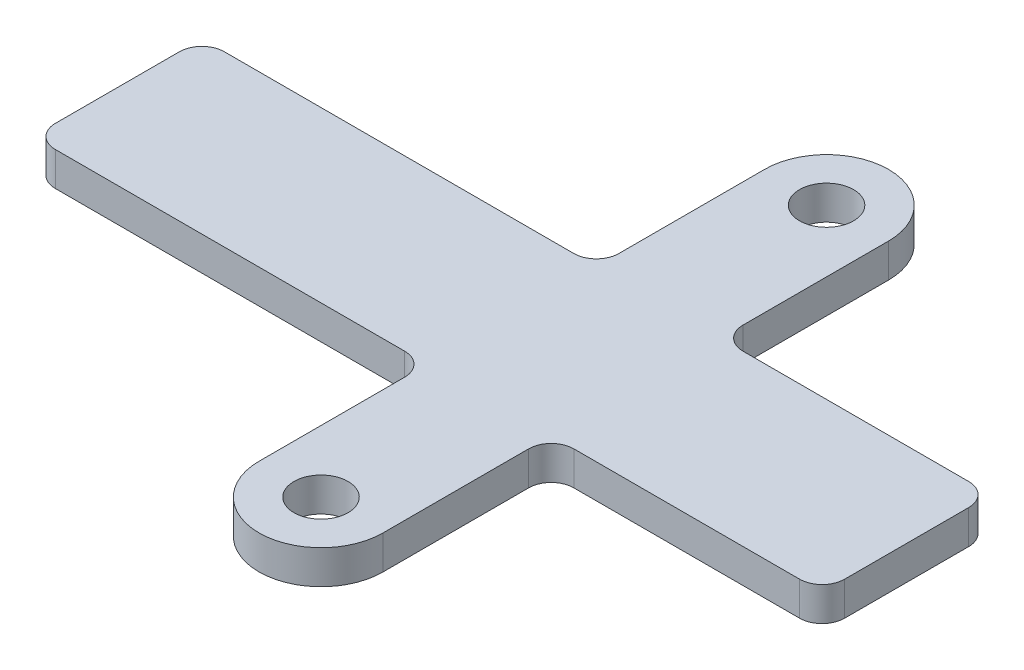
ISO-10303-21;
HEADER;
FILE_DESCRIPTION(('STEP AP214'),'2;1');
FILE_NAME('part.step','',(''),(''),'','','');
FILE_SCHEMA(('AUTOMOTIVE_DESIGN { 1 0 10303 214 1 1 1 1 }'));
ENDSEC;
DATA;
#1=APPLICATION_CONTEXT('core data for automotive mechanical design processes');
#2=APPLICATION_PROTOCOL_DEFINITION('international standard','automotive_design',2000,#1);
#3=PRODUCT_CONTEXT('',#1,'mechanical');
#4=PRODUCT('Part','Part','',(#3));
#5=PRODUCT_RELATED_PRODUCT_CATEGORY('part','',(#4));
#6=PRODUCT_DEFINITION_FORMATION('','',#4);
#7=PRODUCT_DEFINITION_CONTEXT('part definition',#1,'design');
#8=PRODUCT_DEFINITION('design','',#6,#7);
#9=PRODUCT_DEFINITION_SHAPE('','',#8);
#10=(LENGTH_UNIT() NAMED_UNIT(*) SI_UNIT(.MILLI.,.METRE.));
#11=(NAMED_UNIT(*) PLANE_ANGLE_UNIT() SI_UNIT($,.RADIAN.));
#12=(NAMED_UNIT(*) SI_UNIT($,.STERADIAN.) SOLID_ANGLE_UNIT());
#13=UNCERTAINTY_MEASURE_WITH_UNIT(LENGTH_MEASURE(1.E-05),#10,'distance_accuracy_value','');
#14=(GEOMETRIC_REPRESENTATION_CONTEXT(3) GLOBAL_UNCERTAINTY_ASSIGNED_CONTEXT((#13)) GLOBAL_UNIT_ASSIGNED_CONTEXT((#10,
#11,#12)) REPRESENTATION_CONTEXT('',''));
#15=CARTESIAN_POINT('',(0.,0.,0.));
#16=DIRECTION('',(0.,0.,1.));
#17=DIRECTION('',(1.,0.,0.));
#18=AXIS2_PLACEMENT_3D('',#15,#16,#17);
#19=CARTESIAN_POINT('',(0.,1.5,0.));
#20=DIRECTION('',(0.,1.,0.));
#21=DIRECTION('',(0.,0.,1.));
#22=AXIS2_PLACEMENT_3D('',#19,#20,#21);
#23=PLANE('',#22);
#24=CARTESIAN_POINT('',(0.,1.5,-11.2072));
#25=DIRECTION('',(0.,-1.,0.));
#26=DIRECTION('',(0.,0.,-1.));
#27=AXIS2_PLACEMENT_3D('',#24,#25,#26);
#28=CIRCLE('',#27,1.2);
#29=CARTESIAN_POINT('',(0.,1.5,-12.4072));
#30=VERTEX_POINT('',#29);
#31=EDGE_CURVE('E681',#30,#30,#28,.T.);
#32=ORIENTED_EDGE('',*,*,#31,.T.);
#33=EDGE_LOOP('',(#32));
#34=FACE_BOUND('',#33,.T.);
#35=DIRECTION('',(0.,0.,1.));
#36=VECTOR('',#35,1.);
#37=CARTESIAN_POINT('',(14.76,1.5,0.));
#38=LINE('',#37,#36);
#39=CARTESIAN_POINT('',(14.76,1.5,-2.75));
#40=VERTEX_POINT('',#39);
#41=CARTESIAN_POINT('',(14.76,1.5,2.75));
#42=VERTEX_POINT('',#41);
#43=EDGE_CURVE('E206',#40,#42,#38,.T.);
#44=ORIENTED_EDGE('',*,*,#43,.F.);
#45=CARTESIAN_POINT('',(13.76,1.5,-2.75));
#46=DIRECTION('',(0.,1.,0.));
#47=DIRECTION('',(0.,0.,1.));
#48=AXIS2_PLACEMENT_3D('',#45,#46,#47);
#49=CIRCLE('',#48,1.);
#50=CARTESIAN_POINT('',(13.76,1.5,-3.75));
#51=VERTEX_POINT('',#50);
#52=EDGE_CURVE('E282',#40,#51,#49,.T.);
#53=ORIENTED_EDGE('',*,*,#52,.T.);
#54=DIRECTION('',(-1.,0.,0.));
#55=VECTOR('',#54,1.);
#56=CARTESIAN_POINT('',(0.,1.5,-3.75));
#57=LINE('',#56,#55);
#58=CARTESIAN_POINT('',(3.74999999999999,1.5,-3.75));
#59=VERTEX_POINT('',#58);
#60=EDGE_CURVE('E209',#51,#59,#57,.T.);
#61=ORIENTED_EDGE('',*,*,#60,.T.);
#62=CARTESIAN_POINT('',(3.74999999999999,1.5,-4.75));
#63=DIRECTION('',(0.,1.,0.));
#64=DIRECTION('',(0.,0.,1.));
#65=AXIS2_PLACEMENT_3D('',#62,#63,#64);
#66=CIRCLE('',#65,1.);
#67=CARTESIAN_POINT('',(2.74999999999999,1.5,-4.75));
#68=VERTEX_POINT('',#67);
#69=EDGE_CURVE('E311',#59,#68,#66,.F.);
#70=ORIENTED_EDGE('',*,*,#69,.T.);
#71=DIRECTION('',(0.,0.,1.));
#72=VECTOR('',#71,1.);
#73=CARTESIAN_POINT('',(2.75,1.5,0.));
#74=LINE('',#73,#72);
#75=CARTESIAN_POINT('',(2.74999999999999,1.5,-11.2072));
#76=VERTEX_POINT('',#75);
#77=EDGE_CURVE('E212',#76,#68,#74,.T.);
#78=ORIENTED_EDGE('',*,*,#77,.F.);
#79=CARTESIAN_POINT('',(0.,1.5,-11.2072));
#80=DIRECTION('',(0.,1.,0.));
#81=DIRECTION('',(0.,0.,1.));
#82=AXIS2_PLACEMENT_3D('',#79,#80,#81);
#83=CIRCLE('',#82,2.75);
#84=CARTESIAN_POINT('',(-2.75,1.5,-11.2072));
#85=VERTEX_POINT('',#84);
#86=EDGE_CURVE('E215',#76,#85,#83,.T.);
#87=ORIENTED_EDGE('',*,*,#86,.T.);
#88=DIRECTION('',(0.,0.,1.));
#89=VECTOR('',#88,1.);
#90=CARTESIAN_POINT('',(-2.75,1.5,0.));
#91=LINE('',#90,#89);
#92=CARTESIAN_POINT('',(-2.75,1.5,-4.75));
#93=VERTEX_POINT('',#92);
#94=EDGE_CURVE('E250',#85,#93,#91,.T.);
#95=ORIENTED_EDGE('',*,*,#94,.T.);
#96=CARTESIAN_POINT('',(-3.75,1.5,-4.75));
#97=DIRECTION('',(0.,1.,0.));
#98=DIRECTION('',(0.,0.,1.));
#99=AXIS2_PLACEMENT_3D('',#96,#97,#98);
#100=CIRCLE('',#99,1.);
#101=CARTESIAN_POINT('',(-3.75,1.5,-3.75));
#102=VERTEX_POINT('',#101);
#103=EDGE_CURVE('E315',#93,#102,#100,.F.);
#104=ORIENTED_EDGE('',*,*,#103,.T.);
#105=DIRECTION('',(-1.,0.,0.));
#106=VECTOR('',#105,1.);
#107=CARTESIAN_POINT('',(0.,1.5,-3.75));
#108=LINE('',#107,#106);
#109=CARTESIAN_POINT('',(-19.24,1.5,-3.75));
#110=VERTEX_POINT('',#109);
#111=EDGE_CURVE('E365',#102,#110,#108,.T.);
#112=ORIENTED_EDGE('',*,*,#111,.T.);
#113=CARTESIAN_POINT('',(-19.24,1.5,-2.75));
#114=DIRECTION('',(0.,1.,0.));
#115=DIRECTION('',(0.,0.,1.));
#116=AXIS2_PLACEMENT_3D('',#113,#114,#115);
#117=CIRCLE('',#116,1.);
#118=CARTESIAN_POINT('',(-20.24,1.5,-2.75));
#119=VERTEX_POINT('',#118);
#120=EDGE_CURVE('E276',#110,#119,#117,.T.);
#121=ORIENTED_EDGE('',*,*,#120,.T.);
#122=DIRECTION('',(0.,0.,1.));
#123=VECTOR('',#122,1.);
#124=CARTESIAN_POINT('',(-20.24,1.5,0.));
#125=LINE('',#124,#123);
#126=CARTESIAN_POINT('',(-20.24,1.5,2.75));
#127=VERTEX_POINT('',#126);
#128=EDGE_CURVE('E368',#119,#127,#125,.T.);
#129=ORIENTED_EDGE('',*,*,#128,.T.);
#130=CARTESIAN_POINT('',(-19.24,1.5,2.75));
#131=DIRECTION('',(0.,1.,0.));
#132=DIRECTION('',(0.,0.,1.));
#133=AXIS2_PLACEMENT_3D('',#130,#131,#132);
#134=CIRCLE('',#133,1.);
#135=CARTESIAN_POINT('',(-19.24,1.5,3.75));
#136=VERTEX_POINT('',#135);
#137=EDGE_CURVE('E278',#127,#136,#134,.T.);
#138=ORIENTED_EDGE('',*,*,#137,.T.);
#139=DIRECTION('',(-1.,0.,0.));
#140=VECTOR('',#139,1.);
#141=CARTESIAN_POINT('',(0.,1.5,3.75));
#142=LINE('',#141,#140);
#143=CARTESIAN_POINT('',(-3.75,1.5,3.75));
#144=VERTEX_POINT('',#143);
#145=EDGE_CURVE('E184',#144,#136,#142,.T.);
#146=ORIENTED_EDGE('',*,*,#145,.F.);
#147=CARTESIAN_POINT('',(-3.75,1.5,4.75));
#148=DIRECTION('',(0.,1.,0.));
#149=DIRECTION('',(0.,0.,1.));
#150=AXIS2_PLACEMENT_3D('',#147,#148,#149);
#151=CIRCLE('',#150,1.);
#152=CARTESIAN_POINT('',(-2.75,1.5,4.75));
#153=VERTEX_POINT('',#152);
#154=EDGE_CURVE('E180',#144,#153,#151,.F.);
#155=ORIENTED_EDGE('',*,*,#154,.T.);
#156=DIRECTION('',(0.,0.,1.));
#157=VECTOR('',#156,1.);
#158=CARTESIAN_POINT('',(-2.75,1.5,0.));
#159=LINE('',#158,#157);
#160=CARTESIAN_POINT('',(-2.74999999999999,1.5,11.2072));
#161=VERTEX_POINT('',#160);
#162=EDGE_CURVE('E171',#153,#161,#159,.T.);
#163=ORIENTED_EDGE('',*,*,#162,.T.);
#164=CARTESIAN_POINT('',(0.,1.5,11.2072));
#165=DIRECTION('',(0.,1.,0.));
#166=DIRECTION('',(0.,0.,1.));
#167=AXIS2_PLACEMENT_3D('',#164,#165,#166);
#168=CIRCLE('',#167,2.75);
#169=CARTESIAN_POINT('',(2.75,1.5,11.2072));
#170=VERTEX_POINT('',#169);
#171=EDGE_CURVE('E176',#161,#170,#168,.T.);
#172=ORIENTED_EDGE('',*,*,#171,.T.);
#173=DIRECTION('',(0.,0.,1.));
#174=VECTOR('',#173,1.);
#175=CARTESIAN_POINT('',(2.75,1.5,0.));
#176=LINE('',#175,#174);
#177=CARTESIAN_POINT('',(2.75,1.5,4.75));
#178=VERTEX_POINT('',#177);
#179=EDGE_CURVE('E199',#178,#170,#176,.T.);
#180=ORIENTED_EDGE('',*,*,#179,.F.);
#181=CARTESIAN_POINT('',(3.75,1.5,4.75));
#182=DIRECTION('',(0.,1.,0.));
#183=DIRECTION('',(0.,0.,1.));
#184=AXIS2_PLACEMENT_3D('',#181,#182,#183);
#185=CIRCLE('',#184,1.);
#186=CARTESIAN_POINT('',(3.75,1.5,3.75));
#187=VERTEX_POINT('',#186);
#188=EDGE_CURVE('E11',#178,#187,#185,.F.);
#189=ORIENTED_EDGE('',*,*,#188,.T.);
#190=DIRECTION('',(-1.,0.,0.));
#191=VECTOR('',#190,1.);
#192=CARTESIAN_POINT('',(0.,1.5,3.75));
#193=LINE('',#192,#191);
#194=CARTESIAN_POINT('',(13.76,1.5,3.75));
#195=VERTEX_POINT('',#194);
#196=EDGE_CURVE('E201',#195,#187,#193,.T.);
#197=ORIENTED_EDGE('',*,*,#196,.F.);
#198=CARTESIAN_POINT('',(13.76,1.5,2.75));
#199=DIRECTION('',(0.,1.,0.));
#200=DIRECTION('',(0.,0.,1.));
#201=AXIS2_PLACEMENT_3D('',#198,#199,#200);
#202=CIRCLE('',#201,1.);
#203=EDGE_CURVE('E280',#195,#42,#202,.T.);
#204=ORIENTED_EDGE('',*,*,#203,.T.);
#205=EDGE_LOOP('',(#44,#53,#61,#70,#78,#87,#95,#104,#112,#121,#129,#138,#146,#155,#163,#172,
#180,#189,#197,#204));
#206=FACE_BOUND('',#205,.T.);
#207=CARTESIAN_POINT('',(0.,1.5,11.2072));
#208=DIRECTION('',(0.,-1.,0.));
#209=DIRECTION('',(0.,0.,-1.));
#210=AXIS2_PLACEMENT_3D('',#207,#208,#209);
#211=CIRCLE('',#210,1.2);
#212=CARTESIAN_POINT('',(0.,1.5,10.0072));
#213=VERTEX_POINT('',#212);
#214=EDGE_CURVE('E222',#213,#213,#211,.T.);
#215=ORIENTED_EDGE('',*,*,#214,.T.);
#216=EDGE_LOOP('',(#215));
#217=FACE_BOUND('',#216,.T.);
#218=ADVANCED_FACE('F35',(#34,#206,#217),#23,.T.);
#219=CARTESIAN_POINT('',(-2.75,1.5,0.));
#220=DIRECTION('',(1.,0.,0.));
#221=DIRECTION('',(0.,0.,-1.));
#222=AXIS2_PLACEMENT_3D('',#219,#220,#221);
#223=PLANE('',#222);
#224=DIRECTION('',(0.,0.,1.));
#225=VECTOR('',#224,1.);
#226=CARTESIAN_POINT('',(-2.75,0.,0.));
#227=LINE('',#226,#225);
#228=CARTESIAN_POINT('',(-2.75,0.,-11.2072));
#229=VERTEX_POINT('',#228);
#230=CARTESIAN_POINT('',(-2.75,0.,-4.75));
#231=VERTEX_POINT('',#230);
#232=EDGE_CURVE('E218',#229,#231,#227,.T.);
#233=ORIENTED_EDGE('',*,*,#232,.T.);
#234=DIRECTION('',(0.,-1.,0.));
#235=VECTOR('',#234,1.);
#236=CARTESIAN_POINT('',(-2.75,1.5,-4.75));
#237=LINE('',#236,#235);
#238=EDGE_CURVE('E303',#231,#93,#237,.F.);
#239=ORIENTED_EDGE('',*,*,#238,.T.);
#240=ORIENTED_EDGE('',*,*,#94,.F.);
#241=DIRECTION('',(0.,-1.,0.));
#242=VECTOR('',#241,1.);
#243=CARTESIAN_POINT('',(-2.75,1.5,-11.2072));
#244=LINE('',#243,#242);
#245=EDGE_CURVE('E217',#85,#229,#244,.T.);
#246=ORIENTED_EDGE('',*,*,#245,.T.);
#247=EDGE_LOOP('',(#233,#239,#240,#246));
#248=FACE_BOUND('',#247,.T.);
#249=ADVANCED_FACE('F361',(#248),#223,.F.);
#250=CARTESIAN_POINT('',(0.,1.5,-3.75));
#251=DIRECTION('',(0.,0.,1.));
#252=DIRECTION('',(1.,0.,0.));
#253=AXIS2_PLACEMENT_3D('',#250,#251,#252);
#254=PLANE('',#253);
#255=DIRECTION('',(-1.,0.,0.));
#256=VECTOR('',#255,1.);
#257=CARTESIAN_POINT('',(0.,0.,-3.75));
#258=LINE('',#257,#256);
#259=CARTESIAN_POINT('',(-3.75,0.,-3.75));
#260=VERTEX_POINT('',#259);
#261=CARTESIAN_POINT('',(-19.24,0.,-3.75));
#262=VERTEX_POINT('',#261);
#263=EDGE_CURVE('E221',#260,#262,#258,.T.);
#264=ORIENTED_EDGE('',*,*,#263,.T.);
#265=DIRECTION('',(0.,-1.,0.));
#266=VECTOR('',#265,1.);
#267=CARTESIAN_POINT('',(-19.24,1.5,-3.75));
#268=LINE('',#267,#266);
#269=EDGE_CURVE('E301',#262,#110,#268,.F.);
#270=ORIENTED_EDGE('',*,*,#269,.T.);
#271=ORIENTED_EDGE('',*,*,#111,.F.);
#272=DIRECTION('',(0.,-1.,0.));
#273=VECTOR('',#272,1.);
#274=CARTESIAN_POINT('',(-3.75,0.,-3.75));
#275=LINE('',#274,#273);
#276=EDGE_CURVE('E298',#102,#260,#275,.T.);
#277=ORIENTED_EDGE('',*,*,#276,.T.);
#278=EDGE_LOOP('',(#264,#270,#271,#277));
#279=FACE_BOUND('',#278,.T.);
#280=ADVANCED_FACE('F395',(#279),#254,.F.);
#281=CARTESIAN_POINT('',(-20.24,1.5,0.));
#282=DIRECTION('',(1.,0.,0.));
#283=DIRECTION('',(0.,0.,-1.));
#284=AXIS2_PLACEMENT_3D('',#281,#282,#283);
#285=PLANE('',#284);
#286=DIRECTION('',(0.,0.,1.));
#287=VECTOR('',#286,1.);
#288=CARTESIAN_POINT('',(-20.24,0.,0.));
#289=LINE('',#288,#287);
#290=CARTESIAN_POINT('',(-20.24,0.,-2.75));
#291=VERTEX_POINT('',#290);
#292=CARTESIAN_POINT('',(-20.24,0.,2.75));
#293=VERTEX_POINT('',#292);
#294=EDGE_CURVE('E225',#291,#293,#289,.T.);
#295=ORIENTED_EDGE('',*,*,#294,.T.);
#296=DIRECTION('',(0.,-1.,0.));
#297=VECTOR('',#296,1.);
#298=CARTESIAN_POINT('',(-20.24,1.5,2.75));
#299=LINE('',#298,#297);
#300=EDGE_CURVE('E296',#293,#127,#299,.F.);
#301=ORIENTED_EDGE('',*,*,#300,.T.);
#302=ORIENTED_EDGE('',*,*,#128,.F.);
#303=DIRECTION('',(0.,-1.,0.));
#304=VECTOR('',#303,1.);
#305=CARTESIAN_POINT('',(-20.24,1.5,-2.75));
#306=LINE('',#305,#304);
#307=EDGE_CURVE('E293',#119,#291,#306,.T.);
#308=ORIENTED_EDGE('',*,*,#307,.T.);
#309=EDGE_LOOP('',(#295,#301,#302,#308));
#310=FACE_BOUND('',#309,.T.);
#311=ADVANCED_FACE('F386',(#310),#285,.F.);
#312=CARTESIAN_POINT('',(0.,1.5,3.75));
#313=DIRECTION('',(0.,0.,1.));
#314=DIRECTION('',(1.,0.,0.));
#315=AXIS2_PLACEMENT_3D('',#312,#313,#314);
#316=PLANE('',#315);
#317=ORIENTED_EDGE('',*,*,#145,.T.);
#318=DIRECTION('',(0.,-1.,0.));
#319=VECTOR('',#318,1.);
#320=CARTESIAN_POINT('',(-19.24,0.,3.75));
#321=LINE('',#320,#319);
#322=CARTESIAN_POINT('',(-19.24,0.,3.75));
#323=VERTEX_POINT('',#322);
#324=EDGE_CURVE('E290',#136,#323,#321,.T.);
#325=ORIENTED_EDGE('',*,*,#324,.T.);
#326=DIRECTION('',(-1.,0.,0.));
#327=VECTOR('',#326,1.);
#328=CARTESIAN_POINT('',(0.,0.,3.75));
#329=LINE('',#328,#327);
#330=CARTESIAN_POINT('',(-3.75,0.,3.75));
#331=VERTEX_POINT('',#330);
#332=EDGE_CURVE('E228',#331,#323,#329,.T.);
#333=ORIENTED_EDGE('',*,*,#332,.F.);
#334=DIRECTION('',(0.,-1.,0.));
#335=VECTOR('',#334,1.);
#336=CARTESIAN_POINT('',(-3.75,1.5,3.75));
#337=LINE('',#336,#335);
#338=EDGE_CURVE('E288',#331,#144,#337,.F.);
#339=ORIENTED_EDGE('',*,*,#338,.T.);
#340=EDGE_LOOP('',(#317,#325,#333,#339));
#341=FACE_BOUND('',#340,.T.);
#342=ADVANCED_FACE('F377',(#341),#316,.T.);
#343=CARTESIAN_POINT('',(-2.75,1.5,0.));
#344=DIRECTION('',(1.,0.,0.));
#345=DIRECTION('',(0.,0.,-1.));
#346=AXIS2_PLACEMENT_3D('',#343,#344,#345);
#347=PLANE('',#346);
#348=ORIENTED_EDGE('',*,*,#162,.F.);
#349=DIRECTION('',(0.,-1.,0.));
#350=VECTOR('',#349,1.);
#351=CARTESIAN_POINT('',(-2.75,1.5,4.75));
#352=LINE('',#351,#350);
#353=CARTESIAN_POINT('',(-2.75,0.,4.75));
#354=VERTEX_POINT('',#353);
#355=EDGE_CURVE('E305',#153,#354,#352,.T.);
#356=ORIENTED_EDGE('',*,*,#355,.T.);
#357=DIRECTION('',(0.,0.,1.));
#358=VECTOR('',#357,1.);
#359=CARTESIAN_POINT('',(-2.75,0.,0.));
#360=LINE('',#359,#358);
#361=CARTESIAN_POINT('',(-2.74999999999999,0.,11.2072));
#362=VERTEX_POINT('',#361);
#363=EDGE_CURVE('E190',#354,#362,#360,.T.);
#364=ORIENTED_EDGE('',*,*,#363,.T.);
#365=DIRECTION('',(0.,-1.,0.));
#366=VECTOR('',#365,1.);
#367=CARTESIAN_POINT('',(-2.74999999999999,1.5,11.2072));
#368=LINE('',#367,#366);
#369=EDGE_CURVE('E187',#161,#362,#368,.T.);
#370=ORIENTED_EDGE('',*,*,#369,.F.);
#371=EDGE_LOOP('',(#348,#356,#364,#370));
#372=FACE_BOUND('',#371,.T.);
#373=ADVANCED_FACE('F188',(#372),#347,.F.);
#374=CARTESIAN_POINT('',(0.,1.5,11.2072));
#375=DIRECTION('',(0.,-1.,0.));
#376=DIRECTION('',(0.,0.,-1.));
#377=AXIS2_PLACEMENT_3D('',#374,#375,#376);
#378=CYLINDRICAL_SURFACE('',#377,2.75);
#379=CARTESIAN_POINT('',(0.,0.,11.2072));
#380=DIRECTION('',(0.,1.,0.));
#381=DIRECTION('',(0.,0.,1.));
#382=AXIS2_PLACEMENT_3D('',#379,#380,#381);
#383=CIRCLE('',#382,2.75);
#384=CARTESIAN_POINT('',(2.75,0.,11.2072));
#385=VERTEX_POINT('',#384);
#386=EDGE_CURVE('E232',#362,#385,#383,.T.);
#387=ORIENTED_EDGE('',*,*,#386,.T.);
#388=DIRECTION('',(0.,-1.,0.));
#389=VECTOR('',#388,1.);
#390=CARTESIAN_POINT('',(2.75,1.5,11.2072));
#391=LINE('',#390,#389);
#392=EDGE_CURVE('E195',#170,#385,#391,.T.);
#393=ORIENTED_EDGE('',*,*,#392,.F.);
#394=ORIENTED_EDGE('',*,*,#171,.F.);
#395=ORIENTED_EDGE('',*,*,#369,.T.);
#396=EDGE_LOOP('',(#387,#393,#394,#395));
#397=FACE_BOUND('',#396,.T.);
#398=ADVANCED_FACE('F197',(#397),#378,.T.);
#399=CARTESIAN_POINT('',(2.75,1.5,0.));
#400=DIRECTION('',(1.,0.,0.));
#401=DIRECTION('',(0.,0.,-1.));
#402=AXIS2_PLACEMENT_3D('',#399,#400,#401);
#403=PLANE('',#402);
#404=DIRECTION('',(0.,0.,1.));
#405=VECTOR('',#404,1.);
#406=CARTESIAN_POINT('',(2.75,0.,0.));
#407=LINE('',#406,#405);
#408=CARTESIAN_POINT('',(2.75,0.,4.75));
#409=VERTEX_POINT('',#408);
#410=EDGE_CURVE('E234',#409,#385,#407,.T.);
#411=ORIENTED_EDGE('',*,*,#410,.F.);
#412=DIRECTION('',(0.,-1.,0.));
#413=VECTOR('',#412,1.);
#414=CARTESIAN_POINT('',(2.75,1.5,4.75));
#415=LINE('',#414,#413);
#416=EDGE_CURVE('E307',#409,#178,#415,.F.);
#417=ORIENTED_EDGE('',*,*,#416,.T.);
#418=ORIENTED_EDGE('',*,*,#179,.T.);
#419=ORIENTED_EDGE('',*,*,#392,.T.);
#420=EDGE_LOOP('',(#411,#417,#418,#419));
#421=FACE_BOUND('',#420,.T.);
#422=ADVANCED_FACE('F327',(#421),#403,.T.);
#423=CARTESIAN_POINT('',(0.,1.5,3.75));
#424=DIRECTION('',(0.,0.,1.));
#425=DIRECTION('',(1.,0.,0.));
#426=AXIS2_PLACEMENT_3D('',#423,#424,#425);
#427=PLANE('',#426);
#428=DIRECTION('',(-1.,0.,0.));
#429=VECTOR('',#428,1.);
#430=CARTESIAN_POINT('',(0.,0.,3.75));
#431=LINE('',#430,#429);
#432=CARTESIAN_POINT('',(13.76,0.,3.75));
#433=VERTEX_POINT('',#432);
#434=CARTESIAN_POINT('',(3.75,0.,3.75));
#435=VERTEX_POINT('',#434);
#436=EDGE_CURVE('E236',#433,#435,#431,.T.);
#437=ORIENTED_EDGE('',*,*,#436,.F.);
#438=DIRECTION('',(0.,-1.,0.));
#439=VECTOR('',#438,1.);
#440=CARTESIAN_POINT('',(13.76,1.5,3.75));
#441=LINE('',#440,#439);
#442=EDGE_CURVE('E55',#433,#195,#441,.F.);
#443=ORIENTED_EDGE('',*,*,#442,.T.);
#444=ORIENTED_EDGE('',*,*,#196,.T.);
#445=DIRECTION('',(0.,-1.,0.));
#446=VECTOR('',#445,1.);
#447=CARTESIAN_POINT('',(3.75,0.,3.75));
#448=LINE('',#447,#446);
#449=EDGE_CURVE('E284',#187,#435,#448,.T.);
#450=ORIENTED_EDGE('',*,*,#449,.T.);
#451=EDGE_LOOP('',(#437,#443,#444,#450));
#452=FACE_BOUND('',#451,.T.);
#453=ADVANCED_FACE('F328',(#452),#427,.T.);
#454=CARTESIAN_POINT('',(14.76,1.5,0.));
#455=DIRECTION('',(1.,0.,0.));
#456=DIRECTION('',(0.,0.,-1.));
#457=AXIS2_PLACEMENT_3D('',#454,#455,#456);
#458=PLANE('',#457);
#459=DIRECTION('',(0.,0.,1.));
#460=VECTOR('',#459,1.);
#461=CARTESIAN_POINT('',(14.76,0.,0.));
#462=LINE('',#461,#460);
#463=CARTESIAN_POINT('',(14.76,0.,-2.75));
#464=VERTEX_POINT('',#463);
#465=CARTESIAN_POINT('',(14.76,0.,2.75));
#466=VERTEX_POINT('',#465);
#467=EDGE_CURVE('E239',#464,#466,#462,.T.);
#468=ORIENTED_EDGE('',*,*,#467,.F.);
#469=DIRECTION('',(0.,-1.,0.));
#470=VECTOR('',#469,1.);
#471=CARTESIAN_POINT('',(14.76,1.5,-2.75));
#472=LINE('',#471,#470);
#473=EDGE_CURVE('E274',#464,#40,#472,.F.);
#474=ORIENTED_EDGE('',*,*,#473,.T.);
#475=ORIENTED_EDGE('',*,*,#43,.T.);
#476=DIRECTION('',(0.,-1.,0.));
#477=VECTOR('',#476,1.);
#478=CARTESIAN_POINT('',(14.76,1.5,2.75));
#479=LINE('',#478,#477);
#480=EDGE_CURVE('E271',#42,#466,#479,.T.);
#481=ORIENTED_EDGE('',*,*,#480,.T.);
#482=EDGE_LOOP('',(#468,#474,#475,#481));
#483=FACE_BOUND('',#482,.T.);
#484=ADVANCED_FACE('F335',(#483),#458,.T.);
#485=CARTESIAN_POINT('',(0.,1.5,-3.75));
#486=DIRECTION('',(0.,0.,1.));
#487=DIRECTION('',(1.,0.,0.));
#488=AXIS2_PLACEMENT_3D('',#485,#486,#487);
#489=PLANE('',#488);
#490=DIRECTION('',(-1.,0.,0.));
#491=VECTOR('',#490,1.);
#492=CARTESIAN_POINT('',(0.,0.,-3.75));
#493=LINE('',#492,#491);
#494=CARTESIAN_POINT('',(13.76,0.,-3.75));
#495=VERTEX_POINT('',#494);
#496=CARTESIAN_POINT('',(3.74999999999999,0.,-3.75));
#497=VERTEX_POINT('',#496);
#498=EDGE_CURVE('E242',#495,#497,#493,.T.);
#499=ORIENTED_EDGE('',*,*,#498,.T.);
#500=DIRECTION('',(0.,-1.,0.));
#501=VECTOR('',#500,1.);
#502=CARTESIAN_POINT('',(3.74999999999999,1.5,-3.75));
#503=LINE('',#502,#501);
#504=EDGE_CURVE('E261',#497,#59,#503,.F.);
#505=ORIENTED_EDGE('',*,*,#504,.T.);
#506=ORIENTED_EDGE('',*,*,#60,.F.);
#507=DIRECTION('',(0.,-1.,0.));
#508=VECTOR('',#507,1.);
#509=CARTESIAN_POINT('',(13.76,0.,-3.75));
#510=LINE('',#509,#508);
#511=EDGE_CURVE('E258',#51,#495,#510,.T.);
#512=ORIENTED_EDGE('',*,*,#511,.T.);
#513=EDGE_LOOP('',(#499,#505,#506,#512));
#514=FACE_BOUND('',#513,.T.);
#515=ADVANCED_FACE('F343',(#514),#489,.F.);
#516=CARTESIAN_POINT('',(2.75,1.5,0.));
#517=DIRECTION('',(1.,0.,0.));
#518=DIRECTION('',(0.,0.,-1.));
#519=AXIS2_PLACEMENT_3D('',#516,#517,#518);
#520=PLANE('',#519);
#521=ORIENTED_EDGE('',*,*,#77,.T.);
#522=DIRECTION('',(0.,-1.,0.));
#523=VECTOR('',#522,1.);
#524=CARTESIAN_POINT('',(2.74999999999999,1.5,-4.75));
#525=LINE('',#524,#523);
#526=CARTESIAN_POINT('',(2.74999999999999,0.,-4.75));
#527=VERTEX_POINT('',#526);
#528=EDGE_CURVE('E194',#68,#527,#525,.T.);
#529=ORIENTED_EDGE('',*,*,#528,.T.);
#530=DIRECTION('',(0.,0.,1.));
#531=VECTOR('',#530,1.);
#532=CARTESIAN_POINT('',(2.75,0.,0.));
#533=LINE('',#532,#531);
#534=CARTESIAN_POINT('',(2.74999999999999,0.,-11.2072));
#535=VERTEX_POINT('',#534);
#536=EDGE_CURVE('E245',#535,#527,#533,.T.);
#537=ORIENTED_EDGE('',*,*,#536,.F.);
#538=DIRECTION('',(0.,-1.,0.));
#539=VECTOR('',#538,1.);
#540=CARTESIAN_POINT('',(2.74999999999999,1.5,-11.2072));
#541=LINE('',#540,#539);
#542=EDGE_CURVE('E253',#76,#535,#541,.T.);
#543=ORIENTED_EDGE('',*,*,#542,.F.);
#544=EDGE_LOOP('',(#521,#529,#537,#543));
#545=FACE_BOUND('',#544,.T.);
#546=ADVANCED_FACE('F352',(#545),#520,.T.);
#547=CARTESIAN_POINT('',(0.,1.5,-11.2072));
#548=DIRECTION('',(0.,-1.,0.));
#549=DIRECTION('',(0.,0.,-1.));
#550=AXIS2_PLACEMENT_3D('',#547,#548,#549);
#551=CYLINDRICAL_SURFACE('',#550,2.75);
#552=CARTESIAN_POINT('',(0.,0.,-11.2072));
#553=DIRECTION('',(0.,1.,0.));
#554=DIRECTION('',(0.,0.,1.));
#555=AXIS2_PLACEMENT_3D('',#552,#553,#554);
#556=CIRCLE('',#555,2.75);
#557=EDGE_CURVE('E248',#535,#229,#556,.T.);
#558=ORIENTED_EDGE('',*,*,#557,.T.);
#559=ORIENTED_EDGE('',*,*,#245,.F.);
#560=ORIENTED_EDGE('',*,*,#86,.F.);
#561=ORIENTED_EDGE('',*,*,#542,.T.);
#562=EDGE_LOOP('',(#558,#559,#560,#561));
#563=FACE_BOUND('',#562,.T.);
#564=ADVANCED_FACE('F357',(#563),#551,.T.);
#565=CARTESIAN_POINT('',(0.,0.,0.));
#566=DIRECTION('',(0.,1.,0.));
#567=DIRECTION('',(0.,0.,1.));
#568=AXIS2_PLACEMENT_3D('',#565,#566,#567);
#569=PLANE('',#568);
#570=CARTESIAN_POINT('',(0.,0.,-11.2072));
#571=DIRECTION('',(0.,-1.,0.));
#572=DIRECTION('',(0.,0.,-1.));
#573=AXIS2_PLACEMENT_3D('',#570,#571,#572);
#574=CIRCLE('',#573,1.2);
#575=CARTESIAN_POINT('',(0.,0.,-12.4072));
#576=VERTEX_POINT('',#575);
#577=EDGE_CURVE('E682',#576,#576,#574,.T.);
#578=ORIENTED_EDGE('',*,*,#577,.F.);
#579=EDGE_LOOP('',(#578));
#580=FACE_BOUND('',#579,.T.);
#581=CARTESIAN_POINT('',(0.,0.,11.2072));
#582=DIRECTION('',(0.,-1.,0.));
#583=DIRECTION('',(0.,0.,-1.));
#584=AXIS2_PLACEMENT_3D('',#581,#582,#583);
#585=CIRCLE('',#584,1.2);
#586=CARTESIAN_POINT('',(0.,0.,10.0072));
#587=VERTEX_POINT('',#586);
#588=EDGE_CURVE('E679',#587,#587,#585,.T.);
#589=ORIENTED_EDGE('',*,*,#588,.F.);
#590=EDGE_LOOP('',(#589));
#591=FACE_BOUND('',#590,.T.);
#592=ORIENTED_EDGE('',*,*,#498,.F.);
#593=CARTESIAN_POINT('',(13.76,0.,-2.75));
#594=DIRECTION('',(0.,1.,0.));
#595=DIRECTION('',(0.,0.,1.));
#596=AXIS2_PLACEMENT_3D('',#593,#594,#595);
#597=CIRCLE('',#596,1.);
#598=EDGE_CURVE('E269',#495,#464,#597,.F.);
#599=ORIENTED_EDGE('',*,*,#598,.T.);
#600=ORIENTED_EDGE('',*,*,#467,.T.);
#601=CARTESIAN_POINT('',(13.76,0.,2.75));
#602=DIRECTION('',(0.,1.,0.));
#603=DIRECTION('',(0.,0.,1.));
#604=AXIS2_PLACEMENT_3D('',#601,#602,#603);
#605=CIRCLE('',#604,1.);
#606=EDGE_CURVE('E267',#466,#433,#605,.F.);
#607=ORIENTED_EDGE('',*,*,#606,.T.);
#608=ORIENTED_EDGE('',*,*,#436,.T.);
#609=CARTESIAN_POINT('',(3.75,0.,4.75));
#610=DIRECTION('',(0.,1.,0.));
#611=DIRECTION('',(0.,0.,1.));
#612=AXIS2_PLACEMENT_3D('',#609,#610,#611);
#613=CIRCLE('',#612,1.);
#614=EDGE_CURVE('E43',#435,#409,#613,.T.);
#615=ORIENTED_EDGE('',*,*,#614,.T.);
#616=ORIENTED_EDGE('',*,*,#410,.T.);
#617=ORIENTED_EDGE('',*,*,#386,.F.);
#618=ORIENTED_EDGE('',*,*,#363,.F.);
#619=CARTESIAN_POINT('',(-3.75,0.,4.75));
#620=DIRECTION('',(0.,1.,0.));
#621=DIRECTION('',(0.,0.,1.));
#622=AXIS2_PLACEMENT_3D('',#619,#620,#621);
#623=CIRCLE('',#622,1.);
#624=EDGE_CURVE('E317',#354,#331,#623,.T.);
#625=ORIENTED_EDGE('',*,*,#624,.T.);
#626=ORIENTED_EDGE('',*,*,#332,.T.);
#627=CARTESIAN_POINT('',(-19.24,0.,2.75));
#628=DIRECTION('',(0.,1.,0.));
#629=DIRECTION('',(0.,0.,1.));
#630=AXIS2_PLACEMENT_3D('',#627,#628,#629);
#631=CIRCLE('',#630,1.);
#632=EDGE_CURVE('E265',#323,#293,#631,.F.);
#633=ORIENTED_EDGE('',*,*,#632,.T.);
#634=ORIENTED_EDGE('',*,*,#294,.F.);
#635=CARTESIAN_POINT('',(-19.24,0.,-2.75));
#636=DIRECTION('',(0.,1.,0.));
#637=DIRECTION('',(0.,0.,1.));
#638=AXIS2_PLACEMENT_3D('',#635,#636,#637);
#639=CIRCLE('',#638,1.);
#640=EDGE_CURVE('E263',#291,#262,#639,.F.);
#641=ORIENTED_EDGE('',*,*,#640,.T.);
#642=ORIENTED_EDGE('',*,*,#263,.F.);
#643=CARTESIAN_POINT('',(-3.75,0.,-4.75));
#644=DIRECTION('',(0.,1.,0.));
#645=DIRECTION('',(0.,0.,1.));
#646=AXIS2_PLACEMENT_3D('',#643,#644,#645);
#647=CIRCLE('',#646,1.);
#648=EDGE_CURVE('E313',#260,#231,#647,.T.);
#649=ORIENTED_EDGE('',*,*,#648,.T.);
#650=ORIENTED_EDGE('',*,*,#232,.F.);
#651=ORIENTED_EDGE('',*,*,#557,.F.);
#652=ORIENTED_EDGE('',*,*,#536,.T.);
#653=CARTESIAN_POINT('',(3.74999999999999,0.,-4.75));
#654=DIRECTION('',(0.,1.,0.));
#655=DIRECTION('',(0.,0.,1.));
#656=AXIS2_PLACEMENT_3D('',#653,#654,#655);
#657=CIRCLE('',#656,1.);
#658=EDGE_CURVE('E309',#527,#497,#657,.T.);
#659=ORIENTED_EDGE('',*,*,#658,.T.);
#660=EDGE_LOOP('',(#592,#599,#600,#607,#608,#615,#616,#617,#618,#625,#626,#633,#634,#641,#642,
#649,#650,#651,#652,#659));
#661=FACE_BOUND('',#660,.T.);
#662=ADVANCED_FACE('F322',(#580,#591,#661),#569,.F.);
#663=CARTESIAN_POINT('',(0.,0.,11.2072));
#664=DIRECTION('',(0.,-1.,0.));
#665=DIRECTION('',(0.,0.,-1.));
#666=AXIS2_PLACEMENT_3D('',#663,#664,#665);
#667=CYLINDRICAL_SURFACE('',#666,1.2);
#668=ORIENTED_EDGE('',*,*,#214,.F.);
#669=EDGE_LOOP('',(#668));
#670=FACE_BOUND('',#669,.T.);
#671=ORIENTED_EDGE('',*,*,#588,.T.);
#672=EDGE_LOOP('',(#671));
#673=FACE_BOUND('',#672,.T.);
#674=ADVANCED_FACE('F419',(#670,#673),#667,.F.);
#675=CARTESIAN_POINT('',(0.,0.,-11.2072));
#676=DIRECTION('',(0.,-1.,0.));
#677=DIRECTION('',(0.,0.,-1.));
#678=AXIS2_PLACEMENT_3D('',#675,#676,#677);
#679=CYLINDRICAL_SURFACE('',#678,1.2);
#680=ORIENTED_EDGE('',*,*,#31,.F.);
#681=EDGE_LOOP('',(#680));
#682=FACE_BOUND('',#681,.T.);
#683=ORIENTED_EDGE('',*,*,#577,.T.);
#684=EDGE_LOOP('',(#683));
#685=FACE_BOUND('',#684,.T.);
#686=ADVANCED_FACE('F448',(#682,#685),#679,.F.);
#687=CARTESIAN_POINT('',(3.74999999999999,1.5,-4.75));
#688=DIRECTION('',(0.,-1.,0.));
#689=DIRECTION('',(0.,0.,-1.));
#690=AXIS2_PLACEMENT_3D('',#687,#688,#689);
#691=CYLINDRICAL_SURFACE('',#690,1.);
#692=ORIENTED_EDGE('',*,*,#69,.F.);
#693=ORIENTED_EDGE('',*,*,#504,.F.);
#694=ORIENTED_EDGE('',*,*,#658,.F.);
#695=ORIENTED_EDGE('',*,*,#528,.F.);
#696=EDGE_LOOP('',(#692,#693,#694,#695));
#697=FACE_BOUND('',#696,.T.);
#698=ADVANCED_FACE('F349',(#697),#691,.F.);
#699=CARTESIAN_POINT('',(13.76,1.5,-2.75));
#700=DIRECTION('',(0.,1.,0.));
#701=DIRECTION('',(0.,0.,1.));
#702=AXIS2_PLACEMENT_3D('',#699,#700,#701);
#703=CYLINDRICAL_SURFACE('',#702,1.);
#704=ORIENTED_EDGE('',*,*,#52,.F.);
#705=ORIENTED_EDGE('',*,*,#473,.F.);
#706=ORIENTED_EDGE('',*,*,#598,.F.);
#707=ORIENTED_EDGE('',*,*,#511,.F.);
#708=EDGE_LOOP('',(#704,#705,#706,#707));
#709=FACE_BOUND('',#708,.T.);
#710=ADVANCED_FACE('F340',(#709),#703,.T.);
#711=CARTESIAN_POINT('',(13.76,1.5,2.75));
#712=DIRECTION('',(0.,-1.,0.));
#713=DIRECTION('',(0.,0.,-1.));
#714=AXIS2_PLACEMENT_3D('',#711,#712,#713);
#715=CYLINDRICAL_SURFACE('',#714,1.);
#716=ORIENTED_EDGE('',*,*,#203,.F.);
#717=ORIENTED_EDGE('',*,*,#442,.F.);
#718=ORIENTED_EDGE('',*,*,#606,.F.);
#719=ORIENTED_EDGE('',*,*,#480,.F.);
#720=EDGE_LOOP('',(#716,#717,#718,#719));
#721=FACE_BOUND('',#720,.T.);
#722=ADVANCED_FACE('F332',(#721),#715,.T.);
#723=CARTESIAN_POINT('',(-19.24,1.5,2.75));
#724=DIRECTION('',(0.,1.,0.));
#725=DIRECTION('',(0.,0.,1.));
#726=AXIS2_PLACEMENT_3D('',#723,#724,#725);
#727=CYLINDRICAL_SURFACE('',#726,1.);
#728=ORIENTED_EDGE('',*,*,#137,.F.);
#729=ORIENTED_EDGE('',*,*,#300,.F.);
#730=ORIENTED_EDGE('',*,*,#632,.F.);
#731=ORIENTED_EDGE('',*,*,#324,.F.);
#732=EDGE_LOOP('',(#728,#729,#730,#731));
#733=FACE_BOUND('',#732,.T.);
#734=ADVANCED_FACE('F382',(#733),#727,.T.);
#735=CARTESIAN_POINT('',(-19.24,1.5,-2.75));
#736=DIRECTION('',(0.,-1.,0.));
#737=DIRECTION('',(0.,0.,-1.));
#738=AXIS2_PLACEMENT_3D('',#735,#736,#737);
#739=CYLINDRICAL_SURFACE('',#738,1.);
#740=ORIENTED_EDGE('',*,*,#120,.F.);
#741=ORIENTED_EDGE('',*,*,#269,.F.);
#742=ORIENTED_EDGE('',*,*,#640,.F.);
#743=ORIENTED_EDGE('',*,*,#307,.F.);
#744=EDGE_LOOP('',(#740,#741,#742,#743));
#745=FACE_BOUND('',#744,.T.);
#746=ADVANCED_FACE('F391',(#745),#739,.T.);
#747=CARTESIAN_POINT('',(-3.75,1.5,-4.75));
#748=DIRECTION('',(0.,1.,0.));
#749=DIRECTION('',(0.,0.,1.));
#750=AXIS2_PLACEMENT_3D('',#747,#748,#749);
#751=CYLINDRICAL_SURFACE('',#750,1.);
#752=ORIENTED_EDGE('',*,*,#103,.F.);
#753=ORIENTED_EDGE('',*,*,#238,.F.);
#754=ORIENTED_EDGE('',*,*,#648,.F.);
#755=ORIENTED_EDGE('',*,*,#276,.F.);
#756=EDGE_LOOP('',(#752,#753,#754,#755));
#757=FACE_BOUND('',#756,.T.);
#758=ADVANCED_FACE('F399',(#757),#751,.F.);
#759=CARTESIAN_POINT('',(-3.75,1.5,4.75));
#760=DIRECTION('',(0.,-1.,0.));
#761=DIRECTION('',(0.,0.,-1.));
#762=AXIS2_PLACEMENT_3D('',#759,#760,#761);
#763=CYLINDRICAL_SURFACE('',#762,1.);
#764=ORIENTED_EDGE('',*,*,#154,.F.);
#765=ORIENTED_EDGE('',*,*,#338,.F.);
#766=ORIENTED_EDGE('',*,*,#624,.F.);
#767=ORIENTED_EDGE('',*,*,#355,.F.);
#768=EDGE_LOOP('',(#764,#765,#766,#767));
#769=FACE_BOUND('',#768,.T.);
#770=ADVANCED_FACE('F401',(#769),#763,.F.);
#771=CARTESIAN_POINT('',(3.75,1.5,4.75));
#772=DIRECTION('',(0.,1.,0.));
#773=DIRECTION('',(0.,0.,1.));
#774=AXIS2_PLACEMENT_3D('',#771,#772,#773);
#775=CYLINDRICAL_SURFACE('',#774,1.);
#776=ORIENTED_EDGE('',*,*,#188,.F.);
#777=ORIENTED_EDGE('',*,*,#416,.F.);
#778=ORIENTED_EDGE('',*,*,#614,.F.);
#779=ORIENTED_EDGE('',*,*,#449,.F.);
#780=EDGE_LOOP('',(#776,#777,#778,#779));
#781=FACE_BOUND('',#780,.T.);
#782=ADVANCED_FACE('F37',(#781),#775,.F.);
#783=CLOSED_SHELL('',(#218,#249,#280,#311,#342,#373,#398,#422,#453,#484,#515,#546,#564,#662,
#674,#686,#698,#710,#722,#734,#746,#758,#770,#782));
#784=MANIFOLD_SOLID_BREP('B2',#783);
#785=ADVANCED_BREP_SHAPE_REPRESENTATION('',(#18,#784),#14);
#786=SHAPE_DEFINITION_REPRESENTATION(#9,#785);
ENDSEC;
END-ISO-10303-21;
